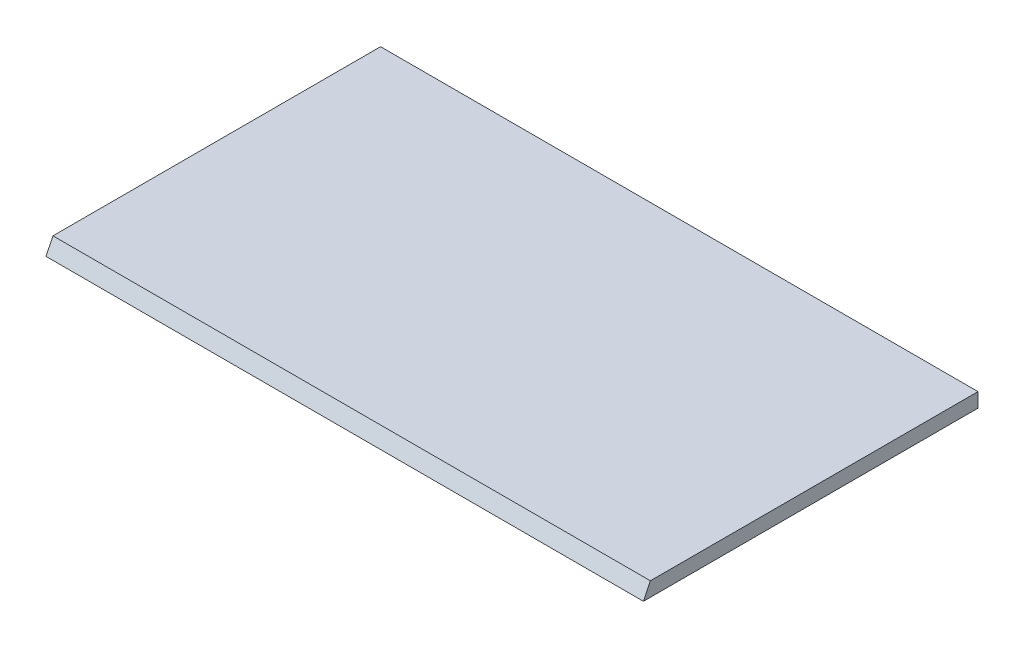
ISO-10303-21;
HEADER;
FILE_DESCRIPTION(('STEP AP214'),'2;1');
FILE_NAME('part.step','',(''),(''),'','','');
FILE_SCHEMA(('AUTOMOTIVE_DESIGN { 1 0 10303 214 1 1 1 1 }'));
ENDSEC;
DATA;
#1=APPLICATION_CONTEXT('core data for automotive mechanical design processes');
#2=APPLICATION_PROTOCOL_DEFINITION('international standard','automotive_design',2000,#1);
#3=PRODUCT_CONTEXT('',#1,'mechanical');
#4=PRODUCT('Part','Part','',(#3));
#5=PRODUCT_RELATED_PRODUCT_CATEGORY('part','',(#4));
#6=PRODUCT_DEFINITION_FORMATION('','',#4);
#7=PRODUCT_DEFINITION_CONTEXT('part definition',#1,'design');
#8=PRODUCT_DEFINITION('design','',#6,#7);
#9=PRODUCT_DEFINITION_SHAPE('','',#8);
#10=(LENGTH_UNIT() NAMED_UNIT(*) SI_UNIT(.MILLI.,.METRE.));
#11=(NAMED_UNIT(*) PLANE_ANGLE_UNIT() SI_UNIT($,.RADIAN.));
#12=(NAMED_UNIT(*) SI_UNIT($,.STERADIAN.) SOLID_ANGLE_UNIT());
#13=UNCERTAINTY_MEASURE_WITH_UNIT(LENGTH_MEASURE(1.E-05),#10,'distance_accuracy_value','');
#14=(GEOMETRIC_REPRESENTATION_CONTEXT(3) GLOBAL_UNCERTAINTY_ASSIGNED_CONTEXT((#13)) GLOBAL_UNIT_ASSIGNED_CONTEXT((#10,
#11,#12)) REPRESENTATION_CONTEXT('',''));
#15=CARTESIAN_POINT('',(0.,0.,0.));
#16=DIRECTION('',(0.,0.,1.));
#17=DIRECTION('',(1.,0.,0.));
#18=AXIS2_PLACEMENT_3D('',#15,#16,#17);
#19=CARTESIAN_POINT('',(0.,0.,140.));
#20=DIRECTION('',(1.,0.,0.));
#21=DIRECTION('',(0.,0.,-1.));
#22=AXIS2_PLACEMENT_3D('',#19,#20,#21);
#23=PLANE('',#22);
#24=DIRECTION('',(0.,0.,-1.));
#25=VECTOR('',#24,1.);
#26=CARTESIAN_POINT('',(0.,-6.,140.));
#27=LINE('',#26,#25);
#28=CARTESIAN_POINT('',(0.,-6.,140.));
#29=VERTEX_POINT('',#28);
#30=CARTESIAN_POINT('',(0.,-6.,0.));
#31=VERTEX_POINT('',#30);
#32=EDGE_CURVE('E11',#29,#31,#27,.T.);
#33=ORIENTED_EDGE('',*,*,#32,.F.);
#34=DIRECTION('',(0.,-0.900348952841943,0.435168660540274));
#35=VECTOR('',#34,1.);
#36=CARTESIAN_POINT('',(0.,0.,137.1));
#37=LINE('',#36,#35);
#38=CARTESIAN_POINT('',(0.,0.,137.1));
#39=VERTEX_POINT('',#38);
#40=EDGE_CURVE('E61',#39,#29,#37,.T.);
#41=ORIENTED_EDGE('',*,*,#40,.F.);
#42=DIRECTION('',(0.,0.,-1.));
#43=VECTOR('',#42,1.);
#44=CARTESIAN_POINT('',(0.,0.,140.));
#45=LINE('',#44,#43);
#46=CARTESIAN_POINT('',(0.,0.,0.));
#47=VERTEX_POINT('',#46);
#48=EDGE_CURVE('E92',#39,#47,#45,.T.);
#49=ORIENTED_EDGE('',*,*,#48,.T.);
#50=DIRECTION('',(0.,-1.,0.));
#51=VECTOR('',#50,1.);
#52=CARTESIAN_POINT('',(0.,0.,0.));
#53=LINE('',#52,#51);
#54=EDGE_CURVE('E105',#47,#31,#53,.T.);
#55=ORIENTED_EDGE('',*,*,#54,.T.);
#56=EDGE_LOOP('',(#33,#41,#49,#55));
#57=FACE_BOUND('',#56,.T.);
#58=ADVANCED_FACE('F45',(#57),#23,.F.);
#59=CARTESIAN_POINT('',(0.,-6.,140.));
#60=DIRECTION('',(0.,1.,0.));
#61=DIRECTION('',(0.,0.,1.));
#62=AXIS2_PLACEMENT_3D('',#59,#60,#61);
#63=PLANE('',#62);
#64=DIRECTION('',(1.,0.,0.));
#65=VECTOR('',#64,1.);
#66=CARTESIAN_POINT('',(0.,-6.,0.));
#67=LINE('',#66,#65);
#68=CARTESIAN_POINT('',(250.,-6.,0.));
#69=VERTEX_POINT('',#68);
#70=EDGE_CURVE('E101',#31,#69,#67,.T.);
#71=ORIENTED_EDGE('',*,*,#70,.T.);
#72=DIRECTION('',(0.,0.,-1.));
#73=VECTOR('',#72,1.);
#74=CARTESIAN_POINT('',(250.,-6.,140.));
#75=LINE('',#74,#73);
#76=CARTESIAN_POINT('',(250.,-6.,140.));
#77=VERTEX_POINT('',#76);
#78=EDGE_CURVE('E54',#77,#69,#75,.T.);
#79=ORIENTED_EDGE('',*,*,#78,.F.);
#80=DIRECTION('',(1.,0.,0.));
#81=VECTOR('',#80,1.);
#82=CARTESIAN_POINT('',(0.,-6.,140.));
#83=LINE('',#82,#81);
#84=EDGE_CURVE('E107',#29,#77,#83,.T.);
#85=ORIENTED_EDGE('',*,*,#84,.F.);
#86=ORIENTED_EDGE('',*,*,#32,.T.);
#87=EDGE_LOOP('',(#71,#79,#85,#86));
#88=FACE_BOUND('',#87,.T.);
#89=ADVANCED_FACE('F124',(#88),#63,.F.);
#90=CARTESIAN_POINT('',(250.,0.,140.));
#91=DIRECTION('',(-1.,0.,0.));
#92=DIRECTION('',(0.,0.,1.));
#93=AXIS2_PLACEMENT_3D('',#90,#91,#92);
#94=PLANE('',#93);
#95=DIRECTION('',(0.,0.,-1.));
#96=VECTOR('',#95,1.);
#97=CARTESIAN_POINT('',(250.,0.,140.));
#98=LINE('',#97,#96);
#99=CARTESIAN_POINT('',(250.,0.,137.1));
#100=VERTEX_POINT('',#99);
#101=CARTESIAN_POINT('',(250.,0.,0.));
#102=VERTEX_POINT('',#101);
#103=EDGE_CURVE('E80',#100,#102,#98,.T.);
#104=ORIENTED_EDGE('',*,*,#103,.F.);
#105=DIRECTION('',(0.,-0.900348952841943,0.435168660540274));
#106=VECTOR('',#105,1.);
#107=CARTESIAN_POINT('',(250.,0.,137.1));
#108=LINE('',#107,#106);
#109=EDGE_CURVE('E119',#100,#77,#108,.T.);
#110=ORIENTED_EDGE('',*,*,#109,.T.);
#111=ORIENTED_EDGE('',*,*,#78,.T.);
#112=DIRECTION('',(0.,1.,0.));
#113=VECTOR('',#112,1.);
#114=CARTESIAN_POINT('',(250.,0.,0.));
#115=LINE('',#114,#113);
#116=EDGE_CURVE('E96',#69,#102,#115,.T.);
#117=ORIENTED_EDGE('',*,*,#116,.T.);
#118=EDGE_LOOP('',(#104,#110,#111,#117));
#119=FACE_BOUND('',#118,.T.);
#120=ADVANCED_FACE('F97',(#119),#94,.F.);
#121=CARTESIAN_POINT('',(0.,0.,140.));
#122=DIRECTION('',(0.,-1.,0.));
#123=DIRECTION('',(0.,0.,-1.));
#124=AXIS2_PLACEMENT_3D('',#121,#122,#123);
#125=PLANE('',#124);
#126=ORIENTED_EDGE('',*,*,#48,.F.);
#127=DIRECTION('',(-1.,0.,0.));
#128=VECTOR('',#127,1.);
#129=CARTESIAN_POINT('',(250.,0.,137.1));
#130=LINE('',#129,#128);
#131=EDGE_CURVE('E88',#100,#39,#130,.T.);
#132=ORIENTED_EDGE('',*,*,#131,.F.);
#133=ORIENTED_EDGE('',*,*,#103,.T.);
#134=DIRECTION('',(-1.,0.,0.));
#135=VECTOR('',#134,1.);
#136=CARTESIAN_POINT('',(0.,0.,0.));
#137=LINE('',#136,#135);
#138=EDGE_CURVE('E85',#102,#47,#137,.T.);
#139=ORIENTED_EDGE('',*,*,#138,.T.);
#140=EDGE_LOOP('',(#126,#132,#133,#139));
#141=FACE_BOUND('',#140,.T.);
#142=ADVANCED_FACE('F83',(#141),#125,.F.);
#143=CARTESIAN_POINT('',(0.,0.,0.));
#144=DIRECTION('',(0.,0.,1.));
#145=DIRECTION('',(1.,0.,0.));
#146=AXIS2_PLACEMENT_3D('',#143,#144,#145);
#147=PLANE('',#146);
#148=ORIENTED_EDGE('',*,*,#54,.F.);
#149=ORIENTED_EDGE('',*,*,#138,.F.);
#150=ORIENTED_EDGE('',*,*,#116,.F.);
#151=ORIENTED_EDGE('',*,*,#70,.F.);
#152=EDGE_LOOP('',(#148,#149,#150,#151));
#153=FACE_BOUND('',#152,.T.);
#154=ADVANCED_FACE('F103',(#153),#147,.F.);
#155=CARTESIAN_POINT('',(250.,0.,137.1));
#156=DIRECTION('',(0.,-0.435168660540275,-0.900348952841943));
#157=DIRECTION('',(0.,0.900348952841943,-0.435168660540275));
#158=AXIS2_PLACEMENT_3D('',#155,#156,#157);
#159=PLANE('',#158);
#160=ORIENTED_EDGE('',*,*,#40,.T.);
#161=ORIENTED_EDGE('',*,*,#84,.T.);
#162=ORIENTED_EDGE('',*,*,#109,.F.);
#163=ORIENTED_EDGE('',*,*,#131,.T.);
#164=EDGE_LOOP('',(#160,#161,#162,#163));
#165=FACE_BOUND('',#164,.T.);
#166=ADVANCED_FACE('F120',(#165),#159,.F.);
#167=CLOSED_SHELL('',(#58,#89,#120,#142,#154,#166));
#168=MANIFOLD_SOLID_BREP('B2',#167);
#169=ADVANCED_BREP_SHAPE_REPRESENTATION('',(#18,#168),#14);
#170=SHAPE_DEFINITION_REPRESENTATION(#9,#169);
ENDSEC;
END-ISO-10303-21;
